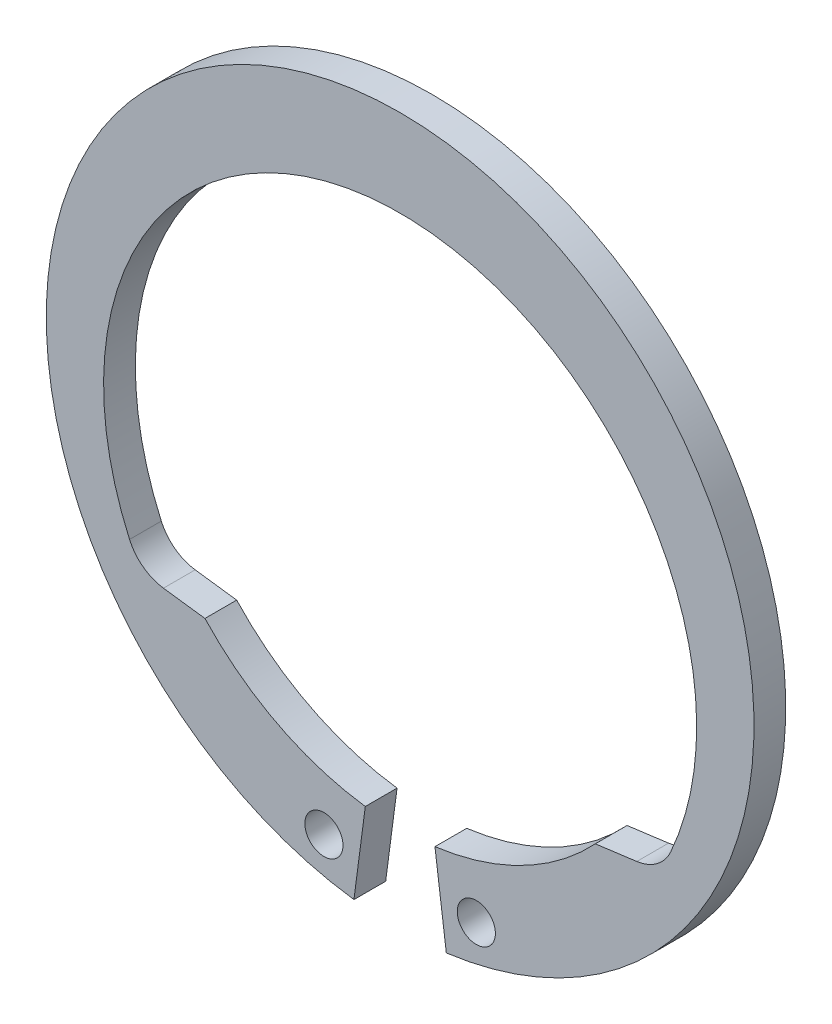
ISO-10303-21;
HEADER;
FILE_DESCRIPTION(('STEP AP214'),'2;1');
FILE_NAME('part.step','',(''),(''),'','','');
FILE_SCHEMA(('AUTOMOTIVE_DESIGN { 1 0 10303 214 1 1 1 1 }'));
ENDSEC;
DATA;
#1=APPLICATION_CONTEXT('core data for automotive mechanical design processes');
#2=APPLICATION_PROTOCOL_DEFINITION('international standard','automotive_design',2000,#1);
#3=PRODUCT_CONTEXT('',#1,'mechanical');
#4=PRODUCT('Part','Part','',(#3));
#5=PRODUCT_RELATED_PRODUCT_CATEGORY('part','',(#4));
#6=PRODUCT_DEFINITION_FORMATION('','',#4);
#7=PRODUCT_DEFINITION_CONTEXT('part definition',#1,'design');
#8=PRODUCT_DEFINITION('design','',#6,#7);
#9=PRODUCT_DEFINITION_SHAPE('','',#8);
#10=(LENGTH_UNIT() NAMED_UNIT(*) SI_UNIT(.MILLI.,.METRE.));
#11=(NAMED_UNIT(*) PLANE_ANGLE_UNIT() SI_UNIT($,.RADIAN.));
#12=(NAMED_UNIT(*) SI_UNIT($,.STERADIAN.) SOLID_ANGLE_UNIT());
#13=UNCERTAINTY_MEASURE_WITH_UNIT(LENGTH_MEASURE(1.E-05),#10,'distance_accuracy_value','');
#14=(GEOMETRIC_REPRESENTATION_CONTEXT(3) GLOBAL_UNCERTAINTY_ASSIGNED_CONTEXT((#13)) GLOBAL_UNIT_ASSIGNED_CONTEXT((#10,
#11,#12)) REPRESENTATION_CONTEXT('',''));
#15=CARTESIAN_POINT('',(0.,0.,0.));
#16=DIRECTION('',(0.,0.,1.));
#17=DIRECTION('',(1.,0.,0.));
#18=AXIS2_PLACEMENT_3D('',#15,#16,#17);
#19=CARTESIAN_POINT('',(0.,0.,-0.889));
#20=DIRECTION('',(0.,0.,1.));
#21=DIRECTION('',(1.,0.,0.));
#22=AXIS2_PLACEMENT_3D('',#19,#20,#21);
#23=CYLINDRICAL_SURFACE('',#22,9.906);
#24=CARTESIAN_POINT('',(0.,0.,0.));
#25=DIRECTION('',(0.,0.,1.));
#26=DIRECTION('',(1.,0.,0.));
#27=AXIS2_PLACEMENT_3D('',#24,#25,#26);
#28=CIRCLE('',#27,9.906);
#29=CARTESIAN_POINT('',(1.29299246013183,-9.82125279676897,0.));
#30=VERTEX_POINT('',#29);
#31=CARTESIAN_POINT('',(-1.29299246013183,-9.82125279676897,0.));
#32=VERTEX_POINT('',#31);
#33=EDGE_CURVE('E141',#30,#32,#28,.T.);
#34=ORIENTED_EDGE('',*,*,#33,.F.);
#35=DIRECTION('',(0.,0.,1.));
#36=VECTOR('',#35,1.);
#37=CARTESIAN_POINT('',(1.29299246013183,-9.82125279676897,-0.889));
#38=LINE('',#37,#36);
#39=CARTESIAN_POINT('',(1.29299246013183,-9.82125279676897,-0.889));
#40=VERTEX_POINT('',#39);
#41=EDGE_CURVE('E11',#40,#30,#38,.T.);
#42=ORIENTED_EDGE('',*,*,#41,.F.);
#43=CARTESIAN_POINT('',(0.,0.,-0.889));
#44=DIRECTION('',(0.,0.,1.));
#45=DIRECTION('',(1.,0.,0.));
#46=AXIS2_PLACEMENT_3D('',#43,#44,#45);
#47=CIRCLE('',#46,9.906);
#48=CARTESIAN_POINT('',(-1.29299246013183,-9.82125279676897,-0.889));
#49=VERTEX_POINT('',#48);
#50=EDGE_CURVE('E168',#40,#49,#47,.T.);
#51=ORIENTED_EDGE('',*,*,#50,.T.);
#52=DIRECTION('',(0.,0.,1.));
#53=VECTOR('',#52,1.);
#54=CARTESIAN_POINT('',(-1.29299246013183,-9.82125279676897,-0.889));
#55=LINE('',#54,#53);
#56=EDGE_CURVE('E35',#49,#32,#55,.T.);
#57=ORIENTED_EDGE('',*,*,#56,.T.);
#58=EDGE_LOOP('',(#34,#42,#51,#57));
#59=FACE_BOUND('',#58,.T.);
#60=ADVANCED_FACE('F32',(#59),#23,.T.);
#61=CARTESIAN_POINT('',(0.974717393022458,-7.40371364679507,-0.889));
#62=DIRECTION('',(-0.99144486137381,-0.130526192220052,0.));
#63=DIRECTION('',(0.130526192220052,-0.99144486137381,0.));
#64=AXIS2_PLACEMENT_3D('',#61,#62,#63);
#65=PLANE('',#64);
#66=DIRECTION('',(0.130526192220052,-0.99144486137381,0.));
#67=VECTOR('',#66,1.);
#68=CARTESIAN_POINT('',(0.974717393022458,-7.40371364679507,0.));
#69=LINE('',#68,#67);
#70=CARTESIAN_POINT('',(0.974717393022458,-7.40371364679507,0.));
#71=VERTEX_POINT('',#70);
#72=EDGE_CURVE('E166',#71,#30,#69,.T.);
#73=ORIENTED_EDGE('',*,*,#72,.F.);
#74=DIRECTION('',(0.,0.,1.));
#75=VECTOR('',#74,1.);
#76=CARTESIAN_POINT('',(0.974717393022458,-7.40371364679507,-0.889));
#77=LINE('',#76,#75);
#78=CARTESIAN_POINT('',(0.974717393022458,-7.40371364679507,-0.889));
#79=VERTEX_POINT('',#78);
#80=EDGE_CURVE('E41',#79,#71,#77,.T.);
#81=ORIENTED_EDGE('',*,*,#80,.F.);
#82=DIRECTION('',(0.130526192220052,-0.99144486137381,0.));
#83=VECTOR('',#82,1.);
#84=CARTESIAN_POINT('',(0.974717393022458,-7.40371364679507,-0.889));
#85=LINE('',#84,#83);
#86=EDGE_CURVE('E131',#79,#40,#85,.T.);
#87=ORIENTED_EDGE('',*,*,#86,.T.);
#88=ORIENTED_EDGE('',*,*,#41,.T.);
#89=EDGE_LOOP('',(#73,#81,#87,#88));
#90=FACE_BOUND('',#89,.T.);
#91=ADVANCED_FACE('F184',(#90),#65,.T.);
#92=CARTESIAN_POINT('',(0.,0.,-0.889));
#93=DIRECTION('',(0.,0.,1.));
#94=DIRECTION('',(1.,0.,0.));
#95=AXIS2_PLACEMENT_3D('',#92,#93,#94);
#96=CYLINDRICAL_SURFACE('',#95,7.4676);
#97=CARTESIAN_POINT('',(0.,0.,0.));
#98=DIRECTION('',(0.,0.,-1.));
#99=DIRECTION('',(1.,0.,0.));
#100=AXIS2_PLACEMENT_3D('',#97,#98,#99);
#101=CIRCLE('',#100,7.4676);
#102=CARTESIAN_POINT('',(5.46404070835992,-5.09011875081374,0.));
#103=VERTEX_POINT('',#102);
#104=EDGE_CURVE('E118',#103,#71,#101,.T.);
#105=ORIENTED_EDGE('',*,*,#104,.F.);
#106=DIRECTION('',(0.,0.,1.));
#107=VECTOR('',#106,1.);
#108=CARTESIAN_POINT('',(5.46404070835992,-5.09011875081374,-0.889));
#109=LINE('',#108,#107);
#110=CARTESIAN_POINT('',(5.46404070835992,-5.09011875081374,-0.889));
#111=VERTEX_POINT('',#110);
#112=EDGE_CURVE('E113',#111,#103,#109,.T.);
#113=ORIENTED_EDGE('',*,*,#112,.F.);
#114=CARTESIAN_POINT('',(0.,0.,-0.889));
#115=DIRECTION('',(0.,0.,-1.));
#116=DIRECTION('',(1.,0.,0.));
#117=AXIS2_PLACEMENT_3D('',#114,#115,#116);
#118=CIRCLE('',#117,7.4676);
#119=EDGE_CURVE('E116',#111,#79,#118,.T.);
#120=ORIENTED_EDGE('',*,*,#119,.T.);
#121=ORIENTED_EDGE('',*,*,#80,.T.);
#122=EDGE_LOOP('',(#105,#113,#120,#121));
#123=FACE_BOUND('',#122,.T.);
#124=ADVANCED_FACE('F115',(#123),#96,.F.);
#125=CARTESIAN_POINT('',(6.62556212564683,-4.93720155522666,-0.889));
#126=DIRECTION('',(-0.130526192220052,0.99144486137381,0.));
#127=DIRECTION('',(-0.99144486137381,-0.130526192220052,0.));
#128=AXIS2_PLACEMENT_3D('',#125,#126,#127);
#129=PLANE('',#128);
#130=DIRECTION('',(-0.99144486137381,-0.130526192220052,0.));
#131=VECTOR('',#130,1.);
#132=CARTESIAN_POINT('',(6.62556212564683,-4.93720155522666,0.));
#133=LINE('',#132,#131);
#134=CARTESIAN_POINT('',(6.62556212564683,-4.93720155522666,0.));
#135=VERTEX_POINT('',#134);
#136=EDGE_CURVE('E163',#135,#103,#133,.T.);
#137=ORIENTED_EDGE('',*,*,#136,.F.);
#138=DIRECTION('',(0.,0.,1.));
#139=VECTOR('',#138,1.);
#140=CARTESIAN_POINT('',(6.62556212564683,-4.93720155522666,-0.889));
#141=LINE('',#140,#139);
#142=CARTESIAN_POINT('',(6.62556212564683,-4.93720155522666,-0.889));
#143=VERTEX_POINT('',#142);
#144=EDGE_CURVE('E123',#143,#135,#141,.T.);
#145=ORIENTED_EDGE('',*,*,#144,.F.);
#146=DIRECTION('',(-0.99144486137381,-0.130526192220052,0.));
#147=VECTOR('',#146,1.);
#148=CARTESIAN_POINT('',(6.62556212564683,-4.93720155522666,-0.889));
#149=LINE('',#148,#147);
#150=EDGE_CURVE('E129',#143,#111,#149,.T.);
#151=ORIENTED_EDGE('',*,*,#150,.T.);
#152=ORIENTED_EDGE('',*,*,#112,.T.);
#153=EDGE_LOOP('',(#137,#145,#151,#152));
#154=FACE_BOUND('',#153,.T.);
#155=ADVANCED_FACE('F133',(#154),#129,.T.);
#156=CARTESIAN_POINT('',(6.46713130530068,-3.73379999999998,-0.889));
#157=DIRECTION('',(0.,0.,1.));
#158=DIRECTION('',(1.,0.,0.));
#159=AXIS2_PLACEMENT_3D('',#156,#157,#158);
#160=CYLINDRICAL_SURFACE('',#159,1.21378565980882);
#161=CARTESIAN_POINT('',(6.46713130530068,-3.73379999999998,0.));
#162=DIRECTION('',(0.,0.,-1.));
#163=DIRECTION('',(1.,0.,0.));
#164=AXIS2_PLACEMENT_3D('',#161,#162,#163);
#165=CIRCLE('',#164,1.21378565980882);
#166=CARTESIAN_POINT('',(7.57466030081692,-4.23044388856434,0.));
#167=VERTEX_POINT('',#166);
#168=EDGE_CURVE('E160',#167,#135,#165,.T.);
#169=ORIENTED_EDGE('',*,*,#168,.F.);
#170=DIRECTION('',(0.,0.,1.));
#171=VECTOR('',#170,1.);
#172=CARTESIAN_POINT('',(7.57466030081692,-4.23044388856434,-0.889));
#173=LINE('',#172,#171);
#174=CARTESIAN_POINT('',(7.57466030081692,-4.23044388856434,-0.889));
#175=VERTEX_POINT('',#174);
#176=EDGE_CURVE('E172',#175,#167,#173,.T.);
#177=ORIENTED_EDGE('',*,*,#176,.F.);
#178=CARTESIAN_POINT('',(6.46713130530068,-3.73379999999998,-0.889));
#179=DIRECTION('',(0.,0.,-1.));
#180=DIRECTION('',(1.,0.,0.));
#181=AXIS2_PLACEMENT_3D('',#178,#179,#180);
#182=CIRCLE('',#181,1.21378565980882);
#183=EDGE_CURVE('E134',#175,#143,#182,.T.);
#184=ORIENTED_EDGE('',*,*,#183,.T.);
#185=ORIENTED_EDGE('',*,*,#144,.T.);
#186=EDGE_LOOP('',(#169,#177,#184,#185));
#187=FACE_BOUND('',#186,.T.);
#188=ADVANCED_FACE('F197',(#187),#160,.F.);
#189=CARTESIAN_POINT('',(0.,-0.833775483870971,-0.889));
#190=DIRECTION('',(0.,0.,1.));
#191=DIRECTION('',(1.,0.,0.));
#192=AXIS2_PLACEMENT_3D('',#189,#190,#191);
#193=CYLINDRICAL_SURFACE('',#192,8.30137548387096);
#194=CARTESIAN_POINT('',(0.,-0.833775483870971,0.));
#195=DIRECTION('',(0.,0.,-1.));
#196=DIRECTION('',(1.,0.,0.));
#197=AXIS2_PLACEMENT_3D('',#194,#195,#196);
#198=CIRCLE('',#197,8.30137548387096);
#199=CARTESIAN_POINT('',(-7.57466030081691,-4.23044388856434,0.));
#200=VERTEX_POINT('',#199);
#201=EDGE_CURVE('E157',#200,#167,#198,.T.);
#202=ORIENTED_EDGE('',*,*,#201,.F.);
#203=DIRECTION('',(0.,0.,1.));
#204=VECTOR('',#203,1.);
#205=CARTESIAN_POINT('',(-7.57466030081691,-4.23044388856434,-0.889));
#206=LINE('',#205,#204);
#207=CARTESIAN_POINT('',(-7.57466030081691,-4.23044388856434,-0.889));
#208=VERTEX_POINT('',#207);
#209=EDGE_CURVE('E174',#208,#200,#206,.T.);
#210=ORIENTED_EDGE('',*,*,#209,.F.);
#211=CARTESIAN_POINT('',(0.,-0.833775483870971,-0.889));
#212=DIRECTION('',(0.,0.,-1.));
#213=DIRECTION('',(1.,0.,0.));
#214=AXIS2_PLACEMENT_3D('',#211,#212,#213);
#215=CIRCLE('',#214,8.30137548387096);
#216=EDGE_CURVE('E136',#208,#175,#215,.T.);
#217=ORIENTED_EDGE('',*,*,#216,.T.);
#218=ORIENTED_EDGE('',*,*,#176,.T.);
#219=EDGE_LOOP('',(#202,#210,#217,#218));
#220=FACE_BOUND('',#219,.T.);
#221=ADVANCED_FACE('F200',(#220),#193,.F.);
#222=CARTESIAN_POINT('',(-6.46713130530068,-3.73379999999998,-0.889));
#223=DIRECTION('',(0.,0.,1.));
#224=DIRECTION('',(1.,0.,0.));
#225=AXIS2_PLACEMENT_3D('',#222,#223,#224);
#226=CYLINDRICAL_SURFACE('',#225,1.21378565980882);
#227=CARTESIAN_POINT('',(-6.46713130530068,-3.73379999999998,0.));
#228=DIRECTION('',(0.,0.,-1.));
#229=DIRECTION('',(1.,0.,0.));
#230=AXIS2_PLACEMENT_3D('',#227,#228,#229);
#231=CIRCLE('',#230,1.21378565980882);
#232=CARTESIAN_POINT('',(-6.62556212564683,-4.93720155522666,0.));
#233=VERTEX_POINT('',#232);
#234=EDGE_CURVE('E154',#233,#200,#231,.T.);
#235=ORIENTED_EDGE('',*,*,#234,.F.);
#236=DIRECTION('',(0.,0.,1.));
#237=VECTOR('',#236,1.);
#238=CARTESIAN_POINT('',(-6.62556212564683,-4.93720155522666,-0.889));
#239=LINE('',#238,#237);
#240=CARTESIAN_POINT('',(-6.62556212564683,-4.93720155522666,-0.889));
#241=VERTEX_POINT('',#240);
#242=EDGE_CURVE('E176',#241,#233,#239,.T.);
#243=ORIENTED_EDGE('',*,*,#242,.F.);
#244=CARTESIAN_POINT('',(-6.46713130530068,-3.73379999999998,-0.889));
#245=DIRECTION('',(0.,0.,-1.));
#246=DIRECTION('',(1.,0.,0.));
#247=AXIS2_PLACEMENT_3D('',#244,#245,#246);
#248=CIRCLE('',#247,1.21378565980882);
#249=EDGE_CURVE('E260',#241,#208,#248,.T.);
#250=ORIENTED_EDGE('',*,*,#249,.T.);
#251=ORIENTED_EDGE('',*,*,#209,.T.);
#252=EDGE_LOOP('',(#235,#243,#250,#251));
#253=FACE_BOUND('',#252,.T.);
#254=ADVANCED_FACE('F204',(#253),#226,.F.);
#255=CARTESIAN_POINT('',(-6.62556212564683,-4.93720155522666,-0.889));
#256=DIRECTION('',(0.130526192220052,0.99144486137381,0.));
#257=DIRECTION('',(-0.99144486137381,0.130526192220052,0.));
#258=AXIS2_PLACEMENT_3D('',#255,#256,#257);
#259=PLANE('',#258);
#260=DIRECTION('',(-0.99144486137381,0.130526192220052,0.));
#261=VECTOR('',#260,1.);
#262=CARTESIAN_POINT('',(-6.62556212564683,-4.93720155522666,0.));
#263=LINE('',#262,#261);
#264=CARTESIAN_POINT('',(-5.46404070835992,-5.09011875081374,0.));
#265=VERTEX_POINT('',#264);
#266=EDGE_CURVE('E151',#265,#233,#263,.T.);
#267=ORIENTED_EDGE('',*,*,#266,.F.);
#268=DIRECTION('',(0.,0.,1.));
#269=VECTOR('',#268,1.);
#270=CARTESIAN_POINT('',(-5.46404070835992,-5.09011875081374,-0.889));
#271=LINE('',#270,#269);
#272=CARTESIAN_POINT('',(-5.46404070835992,-5.09011875081374,-0.889));
#273=VERTEX_POINT('',#272);
#274=EDGE_CURVE('E178',#273,#265,#271,.T.);
#275=ORIENTED_EDGE('',*,*,#274,.F.);
#276=DIRECTION('',(-0.99144486137381,0.130526192220052,0.));
#277=VECTOR('',#276,1.);
#278=CARTESIAN_POINT('',(-6.62556212564683,-4.93720155522666,-0.889));
#279=LINE('',#278,#277);
#280=EDGE_CURVE('E257',#273,#241,#279,.T.);
#281=ORIENTED_EDGE('',*,*,#280,.T.);
#282=ORIENTED_EDGE('',*,*,#242,.T.);
#283=EDGE_LOOP('',(#267,#275,#281,#282));
#284=FACE_BOUND('',#283,.T.);
#285=ADVANCED_FACE('F208',(#284),#259,.T.);
#286=CARTESIAN_POINT('',(0.,0.,-0.889));
#287=DIRECTION('',(0.,0.,1.));
#288=DIRECTION('',(1.,0.,0.));
#289=AXIS2_PLACEMENT_3D('',#286,#287,#288);
#290=CYLINDRICAL_SURFACE('',#289,7.4676);
#291=CARTESIAN_POINT('',(0.,0.,0.));
#292=DIRECTION('',(0.,0.,-1.));
#293=DIRECTION('',(1.,0.,0.));
#294=AXIS2_PLACEMENT_3D('',#291,#292,#293);
#295=CIRCLE('',#294,7.4676);
#296=CARTESIAN_POINT('',(-0.974717393022458,-7.40371364679507,0.));
#297=VERTEX_POINT('',#296);
#298=EDGE_CURVE('E148',#297,#265,#295,.T.);
#299=ORIENTED_EDGE('',*,*,#298,.F.);
#300=DIRECTION('',(0.,0.,1.));
#301=VECTOR('',#300,1.);
#302=CARTESIAN_POINT('',(-0.974717393022458,-7.40371364679507,-0.889));
#303=LINE('',#302,#301);
#304=CARTESIAN_POINT('',(-0.974717393022458,-7.40371364679507,-0.889));
#305=VERTEX_POINT('',#304);
#306=EDGE_CURVE('E179',#305,#297,#303,.T.);
#307=ORIENTED_EDGE('',*,*,#306,.F.);
#308=CARTESIAN_POINT('',(0.,0.,-0.889));
#309=DIRECTION('',(0.,0.,-1.));
#310=DIRECTION('',(1.,0.,0.));
#311=AXIS2_PLACEMENT_3D('',#308,#309,#310);
#312=CIRCLE('',#311,7.4676);
#313=EDGE_CURVE('E254',#305,#273,#312,.T.);
#314=ORIENTED_EDGE('',*,*,#313,.T.);
#315=ORIENTED_EDGE('',*,*,#274,.T.);
#316=EDGE_LOOP('',(#299,#307,#314,#315));
#317=FACE_BOUND('',#316,.T.);
#318=ADVANCED_FACE('F212',(#317),#290,.F.);
#319=CARTESIAN_POINT('',(-0.974717393022458,-7.40371364679507,-0.889));
#320=DIRECTION('',(0.99144486137381,-0.130526192220052,0.));
#321=DIRECTION('',(0.130526192220052,0.99144486137381,0.));
#322=AXIS2_PLACEMENT_3D('',#319,#320,#321);
#323=PLANE('',#322);
#324=DIRECTION('',(0.130526192220052,0.99144486137381,0.));
#325=VECTOR('',#324,1.);
#326=CARTESIAN_POINT('',(-0.974717393022458,-7.40371364679507,0.));
#327=LINE('',#326,#325);
#328=EDGE_CURVE('E144',#32,#297,#327,.T.);
#329=ORIENTED_EDGE('',*,*,#328,.F.);
#330=ORIENTED_EDGE('',*,*,#56,.F.);
#331=DIRECTION('',(0.130526192220052,0.99144486137381,0.));
#332=VECTOR('',#331,1.);
#333=CARTESIAN_POINT('',(-0.974717393022458,-7.40371364679507,-0.889));
#334=LINE('',#333,#332);
#335=EDGE_CURVE('E252',#49,#305,#334,.T.);
#336=ORIENTED_EDGE('',*,*,#335,.T.);
#337=ORIENTED_EDGE('',*,*,#306,.T.);
#338=EDGE_LOOP('',(#329,#330,#336,#337));
#339=FACE_BOUND('',#338,.T.);
#340=ADVANCED_FACE('F181',(#339),#323,.T.);
#341=CARTESIAN_POINT('',(0.,0.,-0.889));
#342=DIRECTION('',(0.,0.,1.));
#343=DIRECTION('',(1.,0.,0.));
#344=AXIS2_PLACEMENT_3D('',#341,#342,#343);
#345=PLANE('',#344);
#346=CARTESIAN_POINT('',(-2.13324352070873,-8.66296110714196,-0.889));
#347=DIRECTION('',(0.,0.,1.));
#348=DIRECTION('',(1.,0.,0.));
#349=AXIS2_PLACEMENT_3D('',#346,#347,#348);
#350=CIRCLE('',#349,0.5334);
#351=CARTESIAN_POINT('',(-1.59984352070873,-8.66296110714196,-0.889));
#352=VERTEX_POINT('',#351);
#353=EDGE_CURVE('E239',#352,#352,#350,.T.);
#354=ORIENTED_EDGE('',*,*,#353,.T.);
#355=EDGE_LOOP('',(#354));
#356=FACE_BOUND('',#355,.T.);
#357=CARTESIAN_POINT('',(2.13324352070873,-8.66296110714196,-0.889));
#358=DIRECTION('',(0.,0.,1.));
#359=DIRECTION('',(1.,0.,0.));
#360=AXIS2_PLACEMENT_3D('',#357,#358,#359);
#361=CIRCLE('',#360,0.5334);
#362=CARTESIAN_POINT('',(2.66664352070873,-8.66296110714196,-0.889));
#363=VERTEX_POINT('',#362);
#364=EDGE_CURVE('E145',#363,#363,#361,.T.);
#365=ORIENTED_EDGE('',*,*,#364,.T.);
#366=EDGE_LOOP('',(#365));
#367=FACE_BOUND('',#366,.T.);
#368=ORIENTED_EDGE('',*,*,#50,.F.);
#369=ORIENTED_EDGE('',*,*,#86,.F.);
#370=ORIENTED_EDGE('',*,*,#119,.F.);
#371=ORIENTED_EDGE('',*,*,#150,.F.);
#372=ORIENTED_EDGE('',*,*,#183,.F.);
#373=ORIENTED_EDGE('',*,*,#216,.F.);
#374=ORIENTED_EDGE('',*,*,#249,.F.);
#375=ORIENTED_EDGE('',*,*,#280,.F.);
#376=ORIENTED_EDGE('',*,*,#313,.F.);
#377=ORIENTED_EDGE('',*,*,#335,.F.);
#378=EDGE_LOOP('',(#368,#369,#370,#371,#372,#373,#374,#375,#376,#377));
#379=FACE_BOUND('',#378,.T.);
#380=ADVANCED_FACE('F127',(#356,#367,#379),#345,.F.);
#381=CARTESIAN_POINT('',(0.,0.,0.));
#382=DIRECTION('',(0.,0.,1.));
#383=DIRECTION('',(1.,0.,0.));
#384=AXIS2_PLACEMENT_3D('',#381,#382,#383);
#385=PLANE('',#384);
#386=CARTESIAN_POINT('',(-2.13324352070873,-8.66296110714196,0.));
#387=DIRECTION('',(0.,0.,1.));
#388=DIRECTION('',(1.,0.,0.));
#389=AXIS2_PLACEMENT_3D('',#386,#387,#388);
#390=CIRCLE('',#389,0.5334);
#391=CARTESIAN_POINT('',(-1.59984352070873,-8.66296110714196,0.));
#392=VERTEX_POINT('',#391);
#393=EDGE_CURVE('E242',#392,#392,#390,.T.);
#394=ORIENTED_EDGE('',*,*,#393,.F.);
#395=EDGE_LOOP('',(#394));
#396=FACE_BOUND('',#395,.T.);
#397=CARTESIAN_POINT('',(2.13324352070873,-8.66296110714196,0.));
#398=DIRECTION('',(0.,0.,1.));
#399=DIRECTION('',(1.,0.,0.));
#400=AXIS2_PLACEMENT_3D('',#397,#398,#399);
#401=CIRCLE('',#400,0.5334);
#402=CARTESIAN_POINT('',(2.66664352070873,-8.66296110714196,0.));
#403=VERTEX_POINT('',#402);
#404=EDGE_CURVE('E244',#403,#403,#401,.T.);
#405=ORIENTED_EDGE('',*,*,#404,.F.);
#406=EDGE_LOOP('',(#405));
#407=FACE_BOUND('',#406,.T.);
#408=ORIENTED_EDGE('',*,*,#33,.T.);
#409=ORIENTED_EDGE('',*,*,#328,.T.);
#410=ORIENTED_EDGE('',*,*,#298,.T.);
#411=ORIENTED_EDGE('',*,*,#266,.T.);
#412=ORIENTED_EDGE('',*,*,#234,.T.);
#413=ORIENTED_EDGE('',*,*,#201,.T.);
#414=ORIENTED_EDGE('',*,*,#168,.T.);
#415=ORIENTED_EDGE('',*,*,#136,.T.);
#416=ORIENTED_EDGE('',*,*,#104,.T.);
#417=ORIENTED_EDGE('',*,*,#72,.T.);
#418=EDGE_LOOP('',(#408,#409,#410,#411,#412,#413,#414,#415,#416,#417));
#419=FACE_BOUND('',#418,.T.);
#420=ADVANCED_FACE('F183',(#396,#407,#419),#385,.T.);
#421=CARTESIAN_POINT('',(2.13324352070873,-8.66296110714196,-0.889));
#422=DIRECTION('',(0.,0.,1.));
#423=DIRECTION('',(1.,0.,0.));
#424=AXIS2_PLACEMENT_3D('',#421,#422,#423);
#425=CYLINDRICAL_SURFACE('',#424,0.5334);
#426=ORIENTED_EDGE('',*,*,#364,.F.);
#427=EDGE_LOOP('',(#426));
#428=FACE_BOUND('',#427,.T.);
#429=ORIENTED_EDGE('',*,*,#404,.T.);
#430=EDGE_LOOP('',(#429));
#431=FACE_BOUND('',#430,.T.);
#432=ADVANCED_FACE('F224',(#428,#431),#425,.F.);
#433=CARTESIAN_POINT('',(-2.13324352070873,-8.66296110714196,-0.889));
#434=DIRECTION('',(0.,0.,1.));
#435=DIRECTION('',(1.,0.,0.));
#436=AXIS2_PLACEMENT_3D('',#433,#434,#435);
#437=CYLINDRICAL_SURFACE('',#436,0.5334);
#438=ORIENTED_EDGE('',*,*,#353,.F.);
#439=EDGE_LOOP('',(#438));
#440=FACE_BOUND('',#439,.T.);
#441=ORIENTED_EDGE('',*,*,#393,.T.);
#442=EDGE_LOOP('',(#441));
#443=FACE_BOUND('',#442,.T.);
#444=ADVANCED_FACE('F231',(#440,#443),#437,.F.);
#445=CLOSED_SHELL('',(#60,#91,#124,#155,#188,#221,#254,#285,#318,#340,#380,#420,#432,#444));
#446=MANIFOLD_SOLID_BREP('B2',#445);
#447=ADVANCED_BREP_SHAPE_REPRESENTATION('',(#18,#446),#14);
#448=SHAPE_DEFINITION_REPRESENTATION(#9,#447);
ENDSEC;
END-ISO-10303-21;
